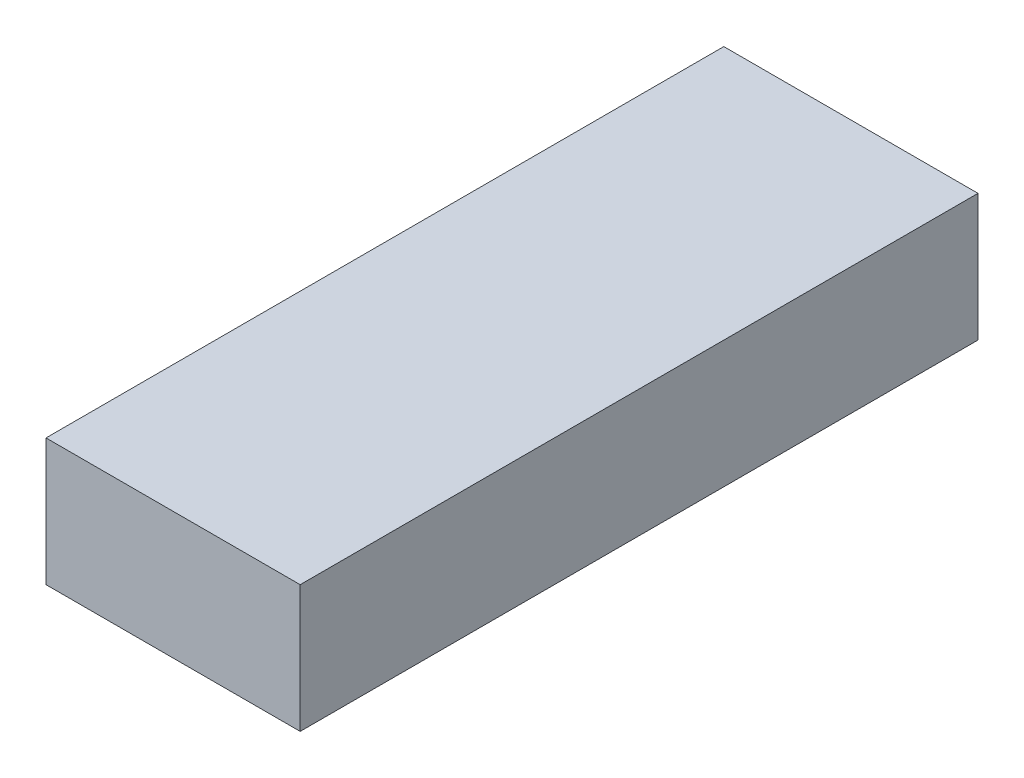
ISO-10303-21;
HEADER;
FILE_DESCRIPTION(('STEP AP214'),'2;1');
FILE_NAME('part.step','',(''),(''),'','','');
FILE_SCHEMA(('AUTOMOTIVE_DESIGN { 1 0 10303 214 1 1 1 1 }'));
ENDSEC;
DATA;
#1=APPLICATION_CONTEXT('core data for automotive mechanical design processes');
#2=APPLICATION_PROTOCOL_DEFINITION('international standard','automotive_design',2000,#1);
#3=PRODUCT_CONTEXT('',#1,'mechanical');
#4=PRODUCT('Part','Part','',(#3));
#5=PRODUCT_RELATED_PRODUCT_CATEGORY('part','',(#4));
#6=PRODUCT_DEFINITION_FORMATION('','',#4);
#7=PRODUCT_DEFINITION_CONTEXT('part definition',#1,'design');
#8=PRODUCT_DEFINITION('design','',#6,#7);
#9=PRODUCT_DEFINITION_SHAPE('','',#8);
#10=(LENGTH_UNIT() NAMED_UNIT(*) SI_UNIT(.MILLI.,.METRE.));
#11=(NAMED_UNIT(*) PLANE_ANGLE_UNIT() SI_UNIT($,.RADIAN.));
#12=(NAMED_UNIT(*) SI_UNIT($,.STERADIAN.) SOLID_ANGLE_UNIT());
#13=UNCERTAINTY_MEASURE_WITH_UNIT(LENGTH_MEASURE(1.E-05),#10,'distance_accuracy_value','');
#14=(GEOMETRIC_REPRESENTATION_CONTEXT(3) GLOBAL_UNCERTAINTY_ASSIGNED_CONTEXT((#13)) GLOBAL_UNIT_ASSIGNED_CONTEXT((#10,
#11,#12)) REPRESENTATION_CONTEXT('',''));
#15=CARTESIAN_POINT('',(0.,0.,0.));
#16=DIRECTION('',(0.,0.,1.));
#17=DIRECTION('',(1.,0.,0.));
#18=AXIS2_PLACEMENT_3D('',#15,#16,#17);
#19=CARTESIAN_POINT('',(0.,0.,8.));
#20=DIRECTION('',(0.,0.,1.));
#21=DIRECTION('',(1.,0.,0.));
#22=AXIS2_PLACEMENT_3D('',#19,#20,#21);
#23=PLANE('',#22);
#24=DIRECTION('',(-1.,0.,0.));
#25=VECTOR('',#24,1.);
#26=CARTESIAN_POINT('',(0.,-1.5,8.));
#27=LINE('',#26,#25);
#28=CARTESIAN_POINT('',(3.,-1.5,8.));
#29=VERTEX_POINT('',#28);
#30=CARTESIAN_POINT('',(-3.,-1.5,8.));
#31=VERTEX_POINT('',#30);
#32=EDGE_CURVE('E10',#29,#31,#27,.T.);
#33=ORIENTED_EDGE('',*,*,#32,.F.);
#34=DIRECTION('',(0.,-1.,0.));
#35=VECTOR('',#34,1.);
#36=CARTESIAN_POINT('',(3.,0.,8.));
#37=LINE('',#36,#35);
#38=CARTESIAN_POINT('',(3.,1.5,8.));
#39=VERTEX_POINT('',#38);
#40=EDGE_CURVE('E60',#39,#29,#37,.T.);
#41=ORIENTED_EDGE('',*,*,#40,.F.);
#42=DIRECTION('',(1.,0.,0.));
#43=VECTOR('',#42,1.);
#44=CARTESIAN_POINT('',(0.,1.5,8.));
#45=LINE('',#44,#43);
#46=CARTESIAN_POINT('',(-3.,1.5,8.));
#47=VERTEX_POINT('',#46);
#48=EDGE_CURVE('E86',#47,#39,#45,.T.);
#49=ORIENTED_EDGE('',*,*,#48,.F.);
#50=DIRECTION('',(0.,1.,0.));
#51=VECTOR('',#50,1.);
#52=CARTESIAN_POINT('',(-3.,0.,8.));
#53=LINE('',#52,#51);
#54=EDGE_CURVE('E23',#31,#47,#53,.T.);
#55=ORIENTED_EDGE('',*,*,#54,.F.);
#56=EDGE_LOOP('',(#33,#41,#49,#55));
#57=FACE_BOUND('',#56,.T.);
#58=ADVANCED_FACE('F16',(#57),#23,.T.);
#59=CARTESIAN_POINT('',(0.,-1.5,-8.));
#60=DIRECTION('',(0.,-1.,0.));
#61=DIRECTION('',(0.,0.,-1.));
#62=AXIS2_PLACEMENT_3D('',#59,#60,#61);
#63=PLANE('',#62);
#64=DIRECTION('',(0.,0.,1.));
#65=VECTOR('',#64,1.);
#66=CARTESIAN_POINT('',(3.,-1.5,-8.));
#67=LINE('',#66,#65);
#68=CARTESIAN_POINT('',(3.,-1.5,-8.));
#69=VERTEX_POINT('',#68);
#70=EDGE_CURVE('E53',#69,#29,#67,.T.);
#71=ORIENTED_EDGE('',*,*,#70,.T.);
#72=ORIENTED_EDGE('',*,*,#32,.T.);
#73=DIRECTION('',(0.,0.,1.));
#74=VECTOR('',#73,1.);
#75=CARTESIAN_POINT('',(-3.,-1.5,-8.));
#76=LINE('',#75,#74);
#77=CARTESIAN_POINT('',(-3.,-1.5,-8.));
#78=VERTEX_POINT('',#77);
#79=EDGE_CURVE('E66',#78,#31,#76,.T.);
#80=ORIENTED_EDGE('',*,*,#79,.F.);
#81=DIRECTION('',(1.,0.,0.));
#82=VECTOR('',#81,1.);
#83=CARTESIAN_POINT('',(0.,-1.5,-8.));
#84=LINE('',#83,#82);
#85=EDGE_CURVE('E64',#78,#69,#84,.T.);
#86=ORIENTED_EDGE('',*,*,#85,.T.);
#87=EDGE_LOOP('',(#71,#72,#80,#86));
#88=FACE_BOUND('',#87,.T.);
#89=ADVANCED_FACE('F65',(#88),#63,.T.);
#90=CARTESIAN_POINT('',(-3.,0.,-8.));
#91=DIRECTION('',(-1.,0.,0.));
#92=DIRECTION('',(0.,0.,1.));
#93=AXIS2_PLACEMENT_3D('',#90,#91,#92);
#94=PLANE('',#93);
#95=ORIENTED_EDGE('',*,*,#79,.T.);
#96=ORIENTED_EDGE('',*,*,#54,.T.);
#97=DIRECTION('',(0.,0.,1.));
#98=VECTOR('',#97,1.);
#99=CARTESIAN_POINT('',(-3.,1.5,-8.));
#100=LINE('',#99,#98);
#101=CARTESIAN_POINT('',(-3.,1.5,-8.));
#102=VERTEX_POINT('',#101);
#103=EDGE_CURVE('E81',#102,#47,#100,.T.);
#104=ORIENTED_EDGE('',*,*,#103,.F.);
#105=DIRECTION('',(0.,-1.,0.));
#106=VECTOR('',#105,1.);
#107=CARTESIAN_POINT('',(-3.,0.,-8.));
#108=LINE('',#107,#106);
#109=EDGE_CURVE('E70',#102,#78,#108,.T.);
#110=ORIENTED_EDGE('',*,*,#109,.T.);
#111=EDGE_LOOP('',(#95,#96,#104,#110));
#112=FACE_BOUND('',#111,.T.);
#113=ADVANCED_FACE('F90',(#112),#94,.T.);
#114=CARTESIAN_POINT('',(0.,1.5,-8.));
#115=DIRECTION('',(0.,1.,0.));
#116=DIRECTION('',(0.,0.,1.));
#117=AXIS2_PLACEMENT_3D('',#114,#115,#116);
#118=PLANE('',#117);
#119=ORIENTED_EDGE('',*,*,#103,.T.);
#120=ORIENTED_EDGE('',*,*,#48,.T.);
#121=DIRECTION('',(0.,0.,1.));
#122=VECTOR('',#121,1.);
#123=CARTESIAN_POINT('',(3.,1.5,-8.));
#124=LINE('',#123,#122);
#125=CARTESIAN_POINT('',(3.,1.5,-8.));
#126=VERTEX_POINT('',#125);
#127=EDGE_CURVE('E61',#126,#39,#124,.T.);
#128=ORIENTED_EDGE('',*,*,#127,.F.);
#129=DIRECTION('',(-1.,0.,0.));
#130=VECTOR('',#129,1.);
#131=CARTESIAN_POINT('',(0.,1.5,-8.));
#132=LINE('',#131,#130);
#133=EDGE_CURVE('E75',#126,#102,#132,.T.);
#134=ORIENTED_EDGE('',*,*,#133,.T.);
#135=EDGE_LOOP('',(#119,#120,#128,#134));
#136=FACE_BOUND('',#135,.T.);
#137=ADVANCED_FACE('F88',(#136),#118,.T.);
#138=CARTESIAN_POINT('',(0.,0.,-8.));
#139=DIRECTION('',(0.,0.,-1.));
#140=DIRECTION('',(-1.,0.,0.));
#141=AXIS2_PLACEMENT_3D('',#138,#139,#140);
#142=PLANE('',#141);
#143=DIRECTION('',(0.,1.,0.));
#144=VECTOR('',#143,1.);
#145=CARTESIAN_POINT('',(3.,0.,-8.));
#146=LINE('',#145,#144);
#147=EDGE_CURVE('E58',#69,#126,#146,.T.);
#148=ORIENTED_EDGE('',*,*,#147,.F.);
#149=ORIENTED_EDGE('',*,*,#85,.F.);
#150=ORIENTED_EDGE('',*,*,#109,.F.);
#151=ORIENTED_EDGE('',*,*,#133,.F.);
#152=EDGE_LOOP('',(#148,#149,#150,#151));
#153=FACE_BOUND('',#152,.T.);
#154=ADVANCED_FACE('F73',(#153),#142,.T.);
#155=CARTESIAN_POINT('',(3.,0.,-8.));
#156=DIRECTION('',(1.,0.,0.));
#157=DIRECTION('',(0.,0.,-1.));
#158=AXIS2_PLACEMENT_3D('',#155,#156,#157);
#159=PLANE('',#158);
#160=ORIENTED_EDGE('',*,*,#147,.T.);
#161=ORIENTED_EDGE('',*,*,#127,.T.);
#162=ORIENTED_EDGE('',*,*,#40,.T.);
#163=ORIENTED_EDGE('',*,*,#70,.F.);
#164=EDGE_LOOP('',(#160,#161,#162,#163));
#165=FACE_BOUND('',#164,.T.);
#166=ADVANCED_FACE('F55',(#165),#159,.T.);
#167=CLOSED_SHELL('',(#58,#89,#113,#137,#154,#166));
#168=MANIFOLD_SOLID_BREP('B1',#167);
#169=ADVANCED_BREP_SHAPE_REPRESENTATION('',(#18,#168),#14);
#170=SHAPE_DEFINITION_REPRESENTATION(#9,#169);
ENDSEC;
END-ISO-10303-21;
